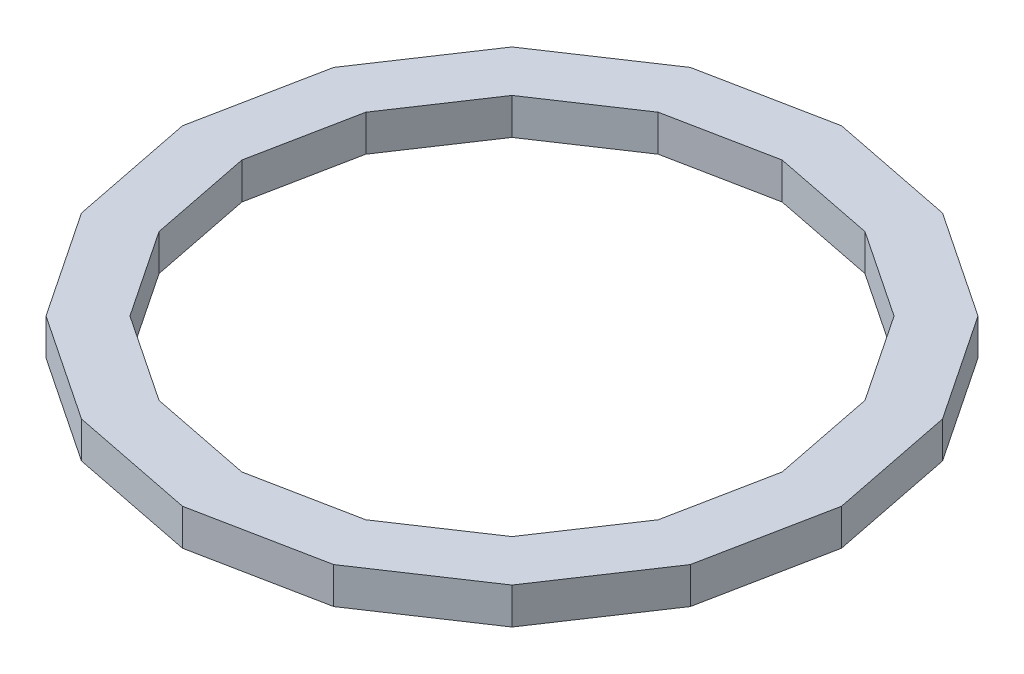
ISO-10303-21;
HEADER;
FILE_DESCRIPTION(('STEP AP214'),'2;1');
FILE_NAME('part.step','',(''),(''),'','','');
FILE_SCHEMA(('AUTOMOTIVE_DESIGN { 1 0 10303 214 1 1 1 1 }'));
ENDSEC;
DATA;
#1=APPLICATION_CONTEXT('core data for automotive mechanical design processes');
#2=APPLICATION_PROTOCOL_DEFINITION('international standard','automotive_design',2000,#1);
#3=PRODUCT_CONTEXT('',#1,'mechanical');
#4=PRODUCT('Part','Part','',(#3));
#5=PRODUCT_RELATED_PRODUCT_CATEGORY('part','',(#4));
#6=PRODUCT_DEFINITION_FORMATION('','',#4);
#7=PRODUCT_DEFINITION_CONTEXT('part definition',#1,'design');
#8=PRODUCT_DEFINITION('design','',#6,#7);
#9=PRODUCT_DEFINITION_SHAPE('','',#8);
#10=(LENGTH_UNIT() NAMED_UNIT(*) SI_UNIT(.MILLI.,.METRE.));
#11=(NAMED_UNIT(*) PLANE_ANGLE_UNIT() SI_UNIT($,.RADIAN.));
#12=(NAMED_UNIT(*) SI_UNIT($,.STERADIAN.) SOLID_ANGLE_UNIT());
#13=UNCERTAINTY_MEASURE_WITH_UNIT(LENGTH_MEASURE(1.E-05),#10,'distance_accuracy_value','');
#14=(GEOMETRIC_REPRESENTATION_CONTEXT(3) GLOBAL_UNCERTAINTY_ASSIGNED_CONTEXT((#13)) GLOBAL_UNIT_ASSIGNED_CONTEXT((#10,
#11,#12)) REPRESENTATION_CONTEXT('',''));
#15=CARTESIAN_POINT('',(0.,0.,0.));
#16=DIRECTION('',(0.,0.,1.));
#17=DIRECTION('',(1.,0.,0.));
#18=AXIS2_PLACEMENT_3D('',#15,#16,#17);
#19=CARTESIAN_POINT('',(0.,19.05,0.));
#20=DIRECTION('',(0.,1.,0.));
#21=DIRECTION('',(0.,0.,1.));
#22=AXIS2_PLACEMENT_3D('',#19,#20,#21);
#23=PLANE('',#22);
#24=DIRECTION('',(0.195090322016118,0.,-0.980785280403233));
#25=VECTOR('',#24,1.);
#26=CARTESIAN_POINT('',(159.378309212576,19.05,66.0166572239397));
#27=LINE('',#26,#25);
#28=CARTESIAN_POINT('',(159.378309212576,19.05,66.0166572239397));
#29=VERTEX_POINT('',#28);
#30=CARTESIAN_POINT('',(172.509838787481,19.05,-1.76942944563561E-12));
#31=VERTEX_POINT('',#30);
#32=EDGE_CURVE('E387',#29,#31,#27,.T.);
#33=ORIENTED_EDGE('',*,*,#32,.T.);
#34=DIRECTION('',(-0.195090322016138,0.,-0.980785280403228));
#35=VECTOR('',#34,1.);
#36=CARTESIAN_POINT('',(172.509838787481,19.05,-1.76942944563561E-12));
#37=LINE('',#36,#35);
#38=CARTESIAN_POINT('',(159.378309212574,19.05,-66.0166572239431));
#39=VERTEX_POINT('',#38);
#40=EDGE_CURVE('E391',#31,#39,#37,.T.);
#41=ORIENTED_EDGE('',*,*,#40,.T.);
#42=DIRECTION('',(-0.555570233019611,0.,-0.831469612302539));
#43=VECTOR('',#42,1.);
#44=CARTESIAN_POINT('',(159.378309212574,19.05,-66.0166572239431));
#45=LINE('',#44,#43);
#46=CARTESIAN_POINT('',(121.982876828024,19.05,-121.982876828027));
#47=VERTEX_POINT('',#46);
#48=EDGE_CURVE('E395',#39,#47,#45,.T.);
#49=ORIENTED_EDGE('',*,*,#48,.T.);
#50=DIRECTION('',(-0.831469612302551,0.,-0.555570233019593));
#51=VECTOR('',#50,1.);
#52=CARTESIAN_POINT('',(121.982876828024,19.05,-121.982876828027));
#53=LINE('',#52,#51);
#54=CARTESIAN_POINT('',(66.0166572239397,19.05,-159.378309212576));
#55=VERTEX_POINT('',#54);
#56=EDGE_CURVE('E398',#47,#55,#53,.T.);
#57=ORIENTED_EDGE('',*,*,#56,.T.);
#58=DIRECTION('',(-0.980785280403232,0.,-0.195090322016118));
#59=VECTOR('',#58,1.);
#60=CARTESIAN_POINT('',(66.0166572239397,19.05,-159.378309212576));
#61=LINE('',#60,#59);
#62=CARTESIAN_POINT('',(-1.85341869222299E-12,19.05,-172.509838787481));
#63=VERTEX_POINT('',#62);
#64=EDGE_CURVE('E401',#55,#63,#61,.T.);
#65=ORIENTED_EDGE('',*,*,#64,.T.);
#66=DIRECTION('',(-0.980785280403228,0.,0.195090322016139));
#67=VECTOR('',#66,1.);
#68=CARTESIAN_POINT('',(-1.85341869222299E-12,19.05,-172.509838787481));
#69=LINE('',#68,#67);
#70=CARTESIAN_POINT('',(-66.016657223943,19.05,-159.378309212574));
#71=VERTEX_POINT('',#70);
#72=EDGE_CURVE('E404',#63,#71,#69,.T.);
#73=ORIENTED_EDGE('',*,*,#72,.T.);
#74=DIRECTION('',(-0.83146961230254,0.,0.555570233019611));
#75=VECTOR('',#74,1.);
#76=CARTESIAN_POINT('',(-66.016657223943,19.05,-159.378309212574));
#77=LINE('',#76,#75);
#78=CARTESIAN_POINT('',(-121.982876828027,19.05,-121.982876828024));
#79=VERTEX_POINT('',#78);
#80=EDGE_CURVE('E406',#71,#79,#77,.T.);
#81=ORIENTED_EDGE('',*,*,#80,.T.);
#82=DIRECTION('',(-0.555570233019593,0.,0.831469612302551));
#83=VECTOR('',#82,1.);
#84=CARTESIAN_POINT('',(-121.982876828027,19.05,-121.982876828024));
#85=LINE('',#84,#83);
#86=CARTESIAN_POINT('',(-159.378309212576,19.05,-66.0166572239396));
#87=VERTEX_POINT('',#86);
#88=EDGE_CURVE('E408',#79,#87,#85,.T.);
#89=ORIENTED_EDGE('',*,*,#88,.T.);
#90=DIRECTION('',(-0.195090322016118,0.,0.980785280403233));
#91=VECTOR('',#90,1.);
#92=CARTESIAN_POINT('',(-159.378309212576,19.05,-66.0166572239396));
#93=LINE('',#92,#91);
#94=CARTESIAN_POINT('',(-172.509838787481,19.05,1.77661318648111E-12));
#95=VERTEX_POINT('',#94);
#96=EDGE_CURVE('E410',#87,#95,#93,.T.);
#97=ORIENTED_EDGE('',*,*,#96,.T.);
#98=DIRECTION('',(0.195090322016138,0.,0.980785280403228));
#99=VECTOR('',#98,1.);
#100=CARTESIAN_POINT('',(-172.509838787481,19.05,1.77661318648111E-12));
#101=LINE('',#100,#99);
#102=CARTESIAN_POINT('',(-159.378309212574,19.05,66.016657223943));
#103=VERTEX_POINT('',#102);
#104=EDGE_CURVE('E412',#95,#103,#101,.T.);
#105=ORIENTED_EDGE('',*,*,#104,.T.);
#106=DIRECTION('',(0.555570233019611,0.,0.83146961230254));
#107=VECTOR('',#106,1.);
#108=CARTESIAN_POINT('',(-159.378309212574,19.05,66.016657223943));
#109=LINE('',#108,#107);
#110=CARTESIAN_POINT('',(-121.982876828024,19.05,121.982876828027));
#111=VERTEX_POINT('',#110);
#112=EDGE_CURVE('E414',#103,#111,#109,.T.);
#113=ORIENTED_EDGE('',*,*,#112,.T.);
#114=DIRECTION('',(0.831469612302551,0.,0.555570233019593));
#115=VECTOR('',#114,1.);
#116=CARTESIAN_POINT('',(-121.982876828024,19.05,121.982876828027));
#117=LINE('',#116,#115);
#118=CARTESIAN_POINT('',(-66.0166572239397,19.05,159.378309212576));
#119=VERTEX_POINT('',#118);
#120=EDGE_CURVE('E416',#111,#119,#117,.T.);
#121=ORIENTED_EDGE('',*,*,#120,.T.);
#122=DIRECTION('',(0.980785280403232,0.,0.195090322016118));
#123=VECTOR('',#122,1.);
#124=CARTESIAN_POINT('',(-66.0166572239397,19.05,159.378309212576));
#125=LINE('',#124,#123);
#126=CARTESIAN_POINT('',(1.72240031464131E-12,19.05,172.509838787481));
#127=VERTEX_POINT('',#126);
#128=EDGE_CURVE('E418',#119,#127,#125,.T.);
#129=ORIENTED_EDGE('',*,*,#128,.T.);
#130=DIRECTION('',(0.980785280403228,0.,-0.195090322016138));
#131=VECTOR('',#130,1.);
#132=CARTESIAN_POINT('',(1.72240031464131E-12,19.05,172.509838787481));
#133=LINE('',#132,#131);
#134=CARTESIAN_POINT('',(66.016657223943,19.05,159.378309212574));
#135=VERTEX_POINT('',#134);
#136=EDGE_CURVE('E420',#127,#135,#133,.T.);
#137=ORIENTED_EDGE('',*,*,#136,.T.);
#138=DIRECTION('',(0.831469612302539,0.,-0.555570233019611));
#139=VECTOR('',#138,1.);
#140=CARTESIAN_POINT('',(66.016657223943,19.05,159.378309212574));
#141=LINE('',#140,#139);
#142=CARTESIAN_POINT('',(121.982876828027,19.05,121.982876828024));
#143=VERTEX_POINT('',#142);
#144=EDGE_CURVE('E422',#135,#143,#141,.T.);
#145=ORIENTED_EDGE('',*,*,#144,.T.);
#146=DIRECTION('',(0.555570233019594,0.,-0.831469612302551));
#147=VECTOR('',#146,1.);
#148=CARTESIAN_POINT('',(121.982876828027,19.05,121.982876828024));
#149=LINE('',#148,#147);
#150=EDGE_CURVE('E424',#143,#29,#149,.T.);
#151=ORIENTED_EDGE('',*,*,#150,.T.);
#152=EDGE_LOOP('',(#33,#41,#49,#57,#65,#73,#81,#89,#97,#105,#113,#121,#129,#137,#145,#151));
#153=FACE_BOUND('',#152,.T.);
#154=DIRECTION('',(-0.195090322016138,0.,-0.980785280403228));
#155=VECTOR('',#154,1.);
#156=CARTESIAN_POINT('',(141.432700285291,19.05,-1.42899333059372E-12));
#157=LINE('',#156,#155);
#158=CARTESIAN_POINT('',(141.432700285291,19.05,-1.42899333059372E-12));
#159=VERTEX_POINT('',#158);
#160=CARTESIAN_POINT('',(130.666777021383,19.05,-54.1239511938395));
#161=VERTEX_POINT('',#160);
#162=EDGE_CURVE('E251',#159,#161,#157,.T.);
#163=ORIENTED_EDGE('',*,*,#162,.F.);
#164=DIRECTION('',(0.195090322016118,0.,-0.980785280403233));
#165=VECTOR('',#164,1.);
#166=CARTESIAN_POINT('',(130.666777021384,19.05,54.1239511938368));
#167=LINE('',#166,#165);
#168=CARTESIAN_POINT('',(130.666777021384,19.05,54.1239511938368));
#169=VERTEX_POINT('',#168);
#170=EDGE_CURVE('E243',#169,#159,#167,.T.);
#171=ORIENTED_EDGE('',*,*,#170,.F.);
#172=DIRECTION('',(0.555570233019594,0.,-0.831469612302551));
#173=VECTOR('',#172,1.);
#174=CARTESIAN_POINT('',(100.008021453255,19.05,100.008021453253));
#175=LINE('',#174,#173);
#176=CARTESIAN_POINT('',(100.008021453255,19.05,100.008021453253));
#177=VERTEX_POINT('',#176);
#178=EDGE_CURVE('E303',#177,#169,#175,.T.);
#179=ORIENTED_EDGE('',*,*,#178,.F.);
#180=DIRECTION('',(0.831469612302539,0.,-0.555570233019611));
#181=VECTOR('',#180,1.);
#182=CARTESIAN_POINT('',(54.1239511938395,19.05,130.666777021383));
#183=LINE('',#182,#181);
#184=CARTESIAN_POINT('',(54.1239511938395,19.05,130.666777021383));
#185=VERTEX_POINT('',#184);
#186=EDGE_CURVE('E300',#185,#177,#183,.T.);
#187=ORIENTED_EDGE('',*,*,#186,.F.);
#188=DIRECTION('',(0.980785280403229,0.,-0.195090322016138));
#189=VECTOR('',#188,1.);
#190=CARTESIAN_POINT('',(1.45536780325047E-12,19.05,141.432700285291));
#191=LINE('',#190,#189);
#192=CARTESIAN_POINT('',(1.45536780325047E-12,19.05,141.432700285291));
#193=VERTEX_POINT('',#192);
#194=EDGE_CURVE('E298',#193,#185,#191,.T.);
#195=ORIENTED_EDGE('',*,*,#194,.F.);
#196=DIRECTION('',(0.980785280403232,0.,0.195090322016118));
#197=VECTOR('',#196,1.);
#198=CARTESIAN_POINT('',(-54.1239511938368,19.05,130.666777021384));
#199=LINE('',#198,#197);
#200=CARTESIAN_POINT('',(-54.1239511938368,19.05,130.666777021384));
#201=VERTEX_POINT('',#200);
#202=EDGE_CURVE('E296',#201,#193,#199,.T.);
#203=ORIENTED_EDGE('',*,*,#202,.F.);
#204=DIRECTION('',(0.831469612302551,0.,0.555570233019594));
#205=VECTOR('',#204,1.);
#206=CARTESIAN_POINT('',(-100.008021453253,19.05,100.008021453255));
#207=LINE('',#206,#205);
#208=CARTESIAN_POINT('',(-100.008021453253,19.05,100.008021453255));
#209=VERTEX_POINT('',#208);
#210=EDGE_CURVE('E293',#209,#201,#207,.T.);
#211=ORIENTED_EDGE('',*,*,#210,.F.);
#212=DIRECTION('',(0.555570233019611,0.,0.83146961230254));
#213=VECTOR('',#212,1.);
#214=CARTESIAN_POINT('',(-130.666777021383,19.05,54.1239511938395));
#215=LINE('',#214,#213);
#216=CARTESIAN_POINT('',(-130.666777021383,19.05,54.1239511938395));
#217=VERTEX_POINT('',#216);
#218=EDGE_CURVE('E291',#217,#209,#215,.T.);
#219=ORIENTED_EDGE('',*,*,#218,.F.);
#220=DIRECTION('',(0.195090322016139,0.,0.980785280403228));
#221=VECTOR('',#220,1.);
#222=CARTESIAN_POINT('',(-141.432700285291,19.05,1.60329975735929E-12));
#223=LINE('',#222,#221);
#224=CARTESIAN_POINT('',(-141.432700285291,19.05,1.60329975735929E-12));
#225=VERTEX_POINT('',#224);
#226=EDGE_CURVE('E289',#225,#217,#223,.T.);
#227=ORIENTED_EDGE('',*,*,#226,.F.);
#228=DIRECTION('',(-0.195090322016118,0.,0.980785280403232));
#229=VECTOR('',#228,1.);
#230=CARTESIAN_POINT('',(-130.666777021384,19.05,-54.1239511938368));
#231=LINE('',#230,#229);
#232=CARTESIAN_POINT('',(-130.666777021384,19.05,-54.1239511938368));
#233=VERTEX_POINT('',#232);
#234=EDGE_CURVE('E287',#233,#225,#231,.T.);
#235=ORIENTED_EDGE('',*,*,#234,.F.);
#236=DIRECTION('',(-0.555570233019594,0.,0.831469612302551));
#237=VECTOR('',#236,1.);
#238=CARTESIAN_POINT('',(-100.008021453255,19.05,-100.008021453253));
#239=LINE('',#238,#237);
#240=CARTESIAN_POINT('',(-100.008021453255,19.05,-100.008021453253));
#241=VERTEX_POINT('',#240);
#242=EDGE_CURVE('E285',#241,#233,#239,.T.);
#243=ORIENTED_EDGE('',*,*,#242,.F.);
#244=DIRECTION('',(-0.831469612302539,0.,0.555570233019611));
#245=VECTOR('',#244,1.);
#246=CARTESIAN_POINT('',(-54.1239511938396,19.05,-130.666777021383));
#247=LINE('',#246,#245);
#248=CARTESIAN_POINT('',(-54.1239511938396,19.05,-130.666777021383));
#249=VERTEX_POINT('',#248);
#250=EDGE_CURVE('E282',#249,#241,#247,.T.);
#251=ORIENTED_EDGE('',*,*,#250,.F.);
#252=DIRECTION('',(-0.980785280403228,0.,0.195090322016138));
#253=VECTOR('',#252,1.);
#254=CARTESIAN_POINT('',(-1.57485512909306E-12,19.05,-141.432700285291));
#255=LINE('',#254,#253);
#256=CARTESIAN_POINT('',(-1.57485512909306E-12,19.05,-141.432700285291));
#257=VERTEX_POINT('',#256);
#258=EDGE_CURVE('E280',#257,#249,#255,.T.);
#259=ORIENTED_EDGE('',*,*,#258,.F.);
#260=DIRECTION('',(-0.980785280403232,0.,-0.195090322016118));
#261=VECTOR('',#260,1.);
#262=CARTESIAN_POINT('',(54.1239511938369,19.05,-130.666777021384));
#263=LINE('',#262,#261);
#264=CARTESIAN_POINT('',(54.1239511938369,19.05,-130.666777021384));
#265=VERTEX_POINT('',#264);
#266=EDGE_CURVE('E277',#265,#257,#263,.T.);
#267=ORIENTED_EDGE('',*,*,#266,.F.);
#268=DIRECTION('',(-0.831469612302551,0.,-0.555570233019593));
#269=VECTOR('',#268,1.);
#270=CARTESIAN_POINT('',(100.008021453253,19.05,-100.008021453255));
#271=LINE('',#270,#269);
#272=CARTESIAN_POINT('',(100.008021453253,19.05,-100.008021453255));
#273=VERTEX_POINT('',#272);
#274=EDGE_CURVE('E272',#273,#265,#271,.T.);
#275=ORIENTED_EDGE('',*,*,#274,.F.);
#276=DIRECTION('',(-0.555570233019611,0.,-0.831469612302539));
#277=VECTOR('',#276,1.);
#278=CARTESIAN_POINT('',(130.666777021383,19.05,-54.1239511938395));
#279=LINE('',#278,#277);
#280=EDGE_CURVE('E265',#161,#273,#279,.T.);
#281=ORIENTED_EDGE('',*,*,#280,.F.);
#282=EDGE_LOOP('',(#163,#171,#179,#187,#195,#203,#211,#219,#227,#235,#243,#251,#259,#267,#275,#281));
#283=FACE_BOUND('',#282,.T.);
#284=ADVANCED_FACE('F34',(#153,#283),#23,.T.);
#285=CARTESIAN_POINT('',(0.,0.,0.));
#286=DIRECTION('',(0.,1.,0.));
#287=DIRECTION('',(0.,0.,1.));
#288=AXIS2_PLACEMENT_3D('',#285,#286,#287);
#289=PLANE('',#288);
#290=DIRECTION('',(0.195090322016118,0.,-0.980785280403233));
#291=VECTOR('',#290,1.);
#292=CARTESIAN_POINT('',(159.378309212576,0.,66.0166572239397));
#293=LINE('',#292,#291);
#294=CARTESIAN_POINT('',(159.378309212576,0.,66.0166572239397));
#295=VERTEX_POINT('',#294);
#296=CARTESIAN_POINT('',(172.509838787481,0.,-1.76942944563561E-12));
#297=VERTEX_POINT('',#296);
#298=EDGE_CURVE('E260',#295,#297,#293,.T.);
#299=ORIENTED_EDGE('',*,*,#298,.F.);
#300=DIRECTION('',(0.555570233019594,0.,-0.831469612302551));
#301=VECTOR('',#300,1.);
#302=CARTESIAN_POINT('',(121.982876828027,0.,121.982876828024));
#303=LINE('',#302,#301);
#304=CARTESIAN_POINT('',(121.982876828027,0.,121.982876828024));
#305=VERTEX_POINT('',#304);
#306=EDGE_CURVE('E392',#305,#295,#303,.T.);
#307=ORIENTED_EDGE('',*,*,#306,.F.);
#308=DIRECTION('',(0.831469612302539,0.,-0.555570233019611));
#309=VECTOR('',#308,1.);
#310=CARTESIAN_POINT('',(66.016657223943,0.,159.378309212574));
#311=LINE('',#310,#309);
#312=CARTESIAN_POINT('',(66.016657223943,0.,159.378309212574));
#313=VERTEX_POINT('',#312);
#314=EDGE_CURVE('E468',#313,#305,#311,.T.);
#315=ORIENTED_EDGE('',*,*,#314,.F.);
#316=DIRECTION('',(0.980785280403228,0.,-0.195090322016138));
#317=VECTOR('',#316,1.);
#318=CARTESIAN_POINT('',(1.72240031464131E-12,0.,172.509838787481));
#319=LINE('',#318,#317);
#320=CARTESIAN_POINT('',(1.72240031464131E-12,0.,172.509838787481));
#321=VERTEX_POINT('',#320);
#322=EDGE_CURVE('E465',#321,#313,#319,.T.);
#323=ORIENTED_EDGE('',*,*,#322,.F.);
#324=DIRECTION('',(0.980785280403232,0.,0.195090322016118));
#325=VECTOR('',#324,1.);
#326=CARTESIAN_POINT('',(-66.0166572239397,0.,159.378309212576));
#327=LINE('',#326,#325);
#328=CARTESIAN_POINT('',(-66.0166572239397,0.,159.378309212576));
#329=VERTEX_POINT('',#328);
#330=EDGE_CURVE('E462',#329,#321,#327,.T.);
#331=ORIENTED_EDGE('',*,*,#330,.F.);
#332=DIRECTION('',(0.831469612302551,0.,0.555570233019593));
#333=VECTOR('',#332,1.);
#334=CARTESIAN_POINT('',(-121.982876828024,0.,121.982876828027));
#335=LINE('',#334,#333);
#336=CARTESIAN_POINT('',(-121.982876828024,0.,121.982876828027));
#337=VERTEX_POINT('',#336);
#338=EDGE_CURVE('E459',#337,#329,#335,.T.);
#339=ORIENTED_EDGE('',*,*,#338,.F.);
#340=DIRECTION('',(0.555570233019611,0.,0.83146961230254));
#341=VECTOR('',#340,1.);
#342=CARTESIAN_POINT('',(-159.378309212574,0.,66.016657223943));
#343=LINE('',#342,#341);
#344=CARTESIAN_POINT('',(-159.378309212574,0.,66.016657223943));
#345=VERTEX_POINT('',#344);
#346=EDGE_CURVE('E456',#345,#337,#343,.T.);
#347=ORIENTED_EDGE('',*,*,#346,.F.);
#348=DIRECTION('',(0.195090322016138,0.,0.980785280403228));
#349=VECTOR('',#348,1.);
#350=CARTESIAN_POINT('',(-172.509838787481,0.,1.77661318648111E-12));
#351=LINE('',#350,#349);
#352=CARTESIAN_POINT('',(-172.509838787481,0.,1.77661318648111E-12));
#353=VERTEX_POINT('',#352);
#354=EDGE_CURVE('E454',#353,#345,#351,.T.);
#355=ORIENTED_EDGE('',*,*,#354,.F.);
#356=DIRECTION('',(-0.195090322016118,0.,0.980785280403233));
#357=VECTOR('',#356,1.);
#358=CARTESIAN_POINT('',(-159.378309212576,0.,-66.0166572239396));
#359=LINE('',#358,#357);
#360=CARTESIAN_POINT('',(-159.378309212576,0.,-66.0166572239396));
#361=VERTEX_POINT('',#360);
#362=EDGE_CURVE('E451',#361,#353,#359,.T.);
#363=ORIENTED_EDGE('',*,*,#362,.F.);
#364=DIRECTION('',(-0.555570233019593,0.,0.831469612302551));
#365=VECTOR('',#364,1.);
#366=CARTESIAN_POINT('',(-121.982876828027,0.,-121.982876828024));
#367=LINE('',#366,#365);
#368=CARTESIAN_POINT('',(-121.982876828027,0.,-121.982876828024));
#369=VERTEX_POINT('',#368);
#370=EDGE_CURVE('E448',#369,#361,#367,.T.);
#371=ORIENTED_EDGE('',*,*,#370,.F.);
#372=DIRECTION('',(-0.83146961230254,0.,0.555570233019611));
#373=VECTOR('',#372,1.);
#374=CARTESIAN_POINT('',(-66.016657223943,0.,-159.378309212574));
#375=LINE('',#374,#373);
#376=CARTESIAN_POINT('',(-66.016657223943,0.,-159.378309212574));
#377=VERTEX_POINT('',#376);
#378=EDGE_CURVE('E445',#377,#369,#375,.T.);
#379=ORIENTED_EDGE('',*,*,#378,.F.);
#380=DIRECTION('',(-0.980785280403228,0.,0.195090322016139));
#381=VECTOR('',#380,1.);
#382=CARTESIAN_POINT('',(-1.85341869222299E-12,0.,-172.509838787481));
#383=LINE('',#382,#381);
#384=CARTESIAN_POINT('',(-1.85341869222299E-12,0.,-172.509838787481));
#385=VERTEX_POINT('',#384);
#386=EDGE_CURVE('E443',#385,#377,#383,.T.);
#387=ORIENTED_EDGE('',*,*,#386,.F.);
#388=DIRECTION('',(-0.980785280403232,0.,-0.195090322016118));
#389=VECTOR('',#388,1.);
#390=CARTESIAN_POINT('',(66.0166572239397,0.,-159.378309212576));
#391=LINE('',#390,#389);
#392=CARTESIAN_POINT('',(66.0166572239397,0.,-159.378309212576));
#393=VERTEX_POINT('',#392);
#394=EDGE_CURVE('E440',#393,#385,#391,.T.);
#395=ORIENTED_EDGE('',*,*,#394,.F.);
#396=DIRECTION('',(-0.831469612302551,0.,-0.555570233019593));
#397=VECTOR('',#396,1.);
#398=CARTESIAN_POINT('',(121.982876828024,0.,-121.982876828027));
#399=LINE('',#398,#397);
#400=CARTESIAN_POINT('',(121.982876828024,0.,-121.982876828027));
#401=VERTEX_POINT('',#400);
#402=EDGE_CURVE('E437',#401,#393,#399,.T.);
#403=ORIENTED_EDGE('',*,*,#402,.F.);
#404=DIRECTION('',(-0.555570233019611,0.,-0.831469612302539));
#405=VECTOR('',#404,1.);
#406=CARTESIAN_POINT('',(159.378309212574,0.,-66.0166572239431));
#407=LINE('',#406,#405);
#408=CARTESIAN_POINT('',(159.378309212574,0.,-66.0166572239431));
#409=VERTEX_POINT('',#408);
#410=EDGE_CURVE('E434',#409,#401,#407,.T.);
#411=ORIENTED_EDGE('',*,*,#410,.F.);
#412=DIRECTION('',(-0.195090322016138,0.,-0.980785280403228));
#413=VECTOR('',#412,1.);
#414=CARTESIAN_POINT('',(172.509838787481,0.,-1.76942944563561E-12));
#415=LINE('',#414,#413);
#416=EDGE_CURVE('E431',#297,#409,#415,.T.);
#417=ORIENTED_EDGE('',*,*,#416,.F.);
#418=EDGE_LOOP('',(#299,#307,#315,#323,#331,#339,#347,#355,#363,#371,#379,#387,#395,#403,#411,#417));
#419=FACE_BOUND('',#418,.T.);
#420=DIRECTION('',(0.195090322016118,0.,-0.980785280403233));
#421=VECTOR('',#420,1.);
#422=CARTESIAN_POINT('',(130.666777021384,0.,54.1239511938368));
#423=LINE('',#422,#421);
#424=CARTESIAN_POINT('',(130.666777021384,0.,54.1239511938368));
#425=VERTEX_POINT('',#424);
#426=CARTESIAN_POINT('',(141.432700285291,0.,-1.42899333059372E-12));
#427=VERTEX_POINT('',#426);
#428=EDGE_CURVE('E57',#425,#427,#423,.T.);
#429=ORIENTED_EDGE('',*,*,#428,.T.);
#430=DIRECTION('',(-0.195090322016138,0.,-0.980785280403228));
#431=VECTOR('',#430,1.);
#432=CARTESIAN_POINT('',(141.432700285291,0.,-1.42899333059372E-12));
#433=LINE('',#432,#431);
#434=CARTESIAN_POINT('',(130.666777021383,0.,-54.1239511938395));
#435=VERTEX_POINT('',#434);
#436=EDGE_CURVE('E258',#427,#435,#433,.T.);
#437=ORIENTED_EDGE('',*,*,#436,.T.);
#438=DIRECTION('',(-0.555570233019611,0.,-0.831469612302539));
#439=VECTOR('',#438,1.);
#440=CARTESIAN_POINT('',(130.666777021383,0.,-54.1239511938395));
#441=LINE('',#440,#439);
#442=CARTESIAN_POINT('',(100.008021453253,0.,-100.008021453255));
#443=VERTEX_POINT('',#442);
#444=EDGE_CURVE('E310',#435,#443,#441,.T.);
#445=ORIENTED_EDGE('',*,*,#444,.T.);
#446=DIRECTION('',(-0.831469612302551,0.,-0.555570233019593));
#447=VECTOR('',#446,1.);
#448=CARTESIAN_POINT('',(100.008021453253,0.,-100.008021453255));
#449=LINE('',#448,#447);
#450=CARTESIAN_POINT('',(54.1239511938369,0.,-130.666777021384));
#451=VERTEX_POINT('',#450);
#452=EDGE_CURVE('E314',#443,#451,#449,.T.);
#453=ORIENTED_EDGE('',*,*,#452,.T.);
#454=DIRECTION('',(-0.980785280403232,0.,-0.195090322016118));
#455=VECTOR('',#454,1.);
#456=CARTESIAN_POINT('',(54.1239511938369,0.,-130.666777021384));
#457=LINE('',#456,#455);
#458=CARTESIAN_POINT('',(-1.57485512909306E-12,0.,-141.432700285291));
#459=VERTEX_POINT('',#458);
#460=EDGE_CURVE('E318',#451,#459,#457,.T.);
#461=ORIENTED_EDGE('',*,*,#460,.T.);
#462=DIRECTION('',(-0.980785280403228,0.,0.195090322016138));
#463=VECTOR('',#462,1.);
#464=CARTESIAN_POINT('',(-1.57485512909306E-12,0.,-141.432700285291));
#465=LINE('',#464,#463);
#466=CARTESIAN_POINT('',(-54.1239511938396,0.,-130.666777021383));
#467=VERTEX_POINT('',#466);
#468=EDGE_CURVE('E322',#459,#467,#465,.T.);
#469=ORIENTED_EDGE('',*,*,#468,.T.);
#470=DIRECTION('',(-0.831469612302539,0.,0.555570233019611));
#471=VECTOR('',#470,1.);
#472=CARTESIAN_POINT('',(-54.1239511938396,0.,-130.666777021383));
#473=LINE('',#472,#471);
#474=CARTESIAN_POINT('',(-100.008021453255,0.,-100.008021453253));
#475=VERTEX_POINT('',#474);
#476=EDGE_CURVE('E325',#467,#475,#473,.T.);
#477=ORIENTED_EDGE('',*,*,#476,.T.);
#478=DIRECTION('',(-0.555570233019594,0.,0.831469612302551));
#479=VECTOR('',#478,1.);
#480=CARTESIAN_POINT('',(-100.008021453255,0.,-100.008021453253));
#481=LINE('',#480,#479);
#482=CARTESIAN_POINT('',(-130.666777021384,0.,-54.1239511938368));
#483=VERTEX_POINT('',#482);
#484=EDGE_CURVE('E329',#475,#483,#481,.T.);
#485=ORIENTED_EDGE('',*,*,#484,.T.);
#486=DIRECTION('',(-0.195090322016118,0.,0.980785280403232));
#487=VECTOR('',#486,1.);
#488=CARTESIAN_POINT('',(-130.666777021384,0.,-54.1239511938368));
#489=LINE('',#488,#487);
#490=CARTESIAN_POINT('',(-141.432700285291,0.,1.60329975735929E-12));
#491=VERTEX_POINT('',#490);
#492=EDGE_CURVE('E332',#483,#491,#489,.T.);
#493=ORIENTED_EDGE('',*,*,#492,.T.);
#494=DIRECTION('',(0.195090322016139,0.,0.980785280403228));
#495=VECTOR('',#494,1.);
#496=CARTESIAN_POINT('',(-141.432700285291,0.,1.60329975735929E-12));
#497=LINE('',#496,#495);
#498=CARTESIAN_POINT('',(-130.666777021383,0.,54.1239511938395));
#499=VERTEX_POINT('',#498);
#500=EDGE_CURVE('E336',#491,#499,#497,.T.);
#501=ORIENTED_EDGE('',*,*,#500,.T.);
#502=DIRECTION('',(0.555570233019611,0.,0.83146961230254));
#503=VECTOR('',#502,1.);
#504=CARTESIAN_POINT('',(-130.666777021383,0.,54.1239511938395));
#505=LINE('',#504,#503);
#506=CARTESIAN_POINT('',(-100.008021453253,0.,100.008021453255));
#507=VERTEX_POINT('',#506);
#508=EDGE_CURVE('E339',#499,#507,#505,.T.);
#509=ORIENTED_EDGE('',*,*,#508,.T.);
#510=DIRECTION('',(0.831469612302551,0.,0.555570233019594));
#511=VECTOR('',#510,1.);
#512=CARTESIAN_POINT('',(-100.008021453253,0.,100.008021453255));
#513=LINE('',#512,#511);
#514=CARTESIAN_POINT('',(-54.1239511938368,0.,130.666777021384));
#515=VERTEX_POINT('',#514);
#516=EDGE_CURVE('E343',#507,#515,#513,.T.);
#517=ORIENTED_EDGE('',*,*,#516,.T.);
#518=DIRECTION('',(0.980785280403232,0.,0.195090322016118));
#519=VECTOR('',#518,1.);
#520=CARTESIAN_POINT('',(-54.1239511938368,0.,130.666777021384));
#521=LINE('',#520,#519);
#522=CARTESIAN_POINT('',(1.45536780325047E-12,0.,141.432700285291));
#523=VERTEX_POINT('',#522);
#524=EDGE_CURVE('E346',#515,#523,#521,.T.);
#525=ORIENTED_EDGE('',*,*,#524,.T.);
#526=DIRECTION('',(0.980785280403229,0.,-0.195090322016138));
#527=VECTOR('',#526,1.);
#528=CARTESIAN_POINT('',(1.45536780325047E-12,0.,141.432700285291));
#529=LINE('',#528,#527);
#530=CARTESIAN_POINT('',(54.1239511938395,0.,130.666777021383));
#531=VERTEX_POINT('',#530);
#532=EDGE_CURVE('E349',#523,#531,#529,.T.);
#533=ORIENTED_EDGE('',*,*,#532,.T.);
#534=DIRECTION('',(0.831469612302539,0.,-0.555570233019611));
#535=VECTOR('',#534,1.);
#536=CARTESIAN_POINT('',(54.1239511938395,0.,130.666777021383));
#537=LINE('',#536,#535);
#538=CARTESIAN_POINT('',(100.008021453255,0.,100.008021453253));
#539=VERTEX_POINT('',#538);
#540=EDGE_CURVE('E352',#531,#539,#537,.T.);
#541=ORIENTED_EDGE('',*,*,#540,.T.);
#542=DIRECTION('',(0.555570233019594,0.,-0.831469612302551));
#543=VECTOR('',#542,1.);
#544=CARTESIAN_POINT('',(100.008021453255,0.,100.008021453253));
#545=LINE('',#544,#543);
#546=EDGE_CURVE('E252',#539,#425,#545,.T.);
#547=ORIENTED_EDGE('',*,*,#546,.T.);
#548=EDGE_LOOP('',(#429,#437,#445,#453,#461,#469,#477,#485,#493,#501,#509,#517,#525,#533,#541,#547));
#549=FACE_BOUND('',#548,.T.);
#550=ADVANCED_FACE('F530',(#419,#549),#289,.F.);
#551=CARTESIAN_POINT('',(159.378309212576,19.05,66.0166572239397));
#552=DIRECTION('',(-0.980785280403233,0.,-0.195090322016118));
#553=DIRECTION('',(-0.195090322016118,0.,0.980785280403233));
#554=AXIS2_PLACEMENT_3D('',#551,#552,#553);
#555=PLANE('',#554);
#556=ORIENTED_EDGE('',*,*,#298,.T.);
#557=DIRECTION('',(0.,-1.,0.));
#558=VECTOR('',#557,1.);
#559=CARTESIAN_POINT('',(172.509838787481,19.05,-1.76942944563561E-12));
#560=LINE('',#559,#558);
#561=EDGE_CURVE('E11',#31,#297,#560,.T.);
#562=ORIENTED_EDGE('',*,*,#561,.F.);
#563=ORIENTED_EDGE('',*,*,#32,.F.);
#564=DIRECTION('',(0.,-1.,0.));
#565=VECTOR('',#564,1.);
#566=CARTESIAN_POINT('',(159.378309212576,19.05,66.0166572239397));
#567=LINE('',#566,#565);
#568=EDGE_CURVE('E427',#29,#295,#567,.T.);
#569=ORIENTED_EDGE('',*,*,#568,.T.);
#570=EDGE_LOOP('',(#556,#562,#563,#569));
#571=FACE_BOUND('',#570,.T.);
#572=ADVANCED_FACE('F36',(#571),#555,.F.);
#573=CARTESIAN_POINT('',(172.509838787481,19.05,-1.76942944563561E-12));
#574=DIRECTION('',(-0.980785280403228,0.,0.195090322016138));
#575=DIRECTION('',(0.195090322016138,0.,0.980785280403229));
#576=AXIS2_PLACEMENT_3D('',#573,#574,#575);
#577=PLANE('',#576);
#578=ORIENTED_EDGE('',*,*,#416,.T.);
#579=DIRECTION('',(0.,-1.,0.));
#580=VECTOR('',#579,1.);
#581=CARTESIAN_POINT('',(159.378309212574,19.05,-66.0166572239431));
#582=LINE('',#581,#580);
#583=EDGE_CURVE('E42',#39,#409,#582,.T.);
#584=ORIENTED_EDGE('',*,*,#583,.F.);
#585=ORIENTED_EDGE('',*,*,#40,.F.);
#586=ORIENTED_EDGE('',*,*,#561,.T.);
#587=EDGE_LOOP('',(#578,#584,#585,#586));
#588=FACE_BOUND('',#587,.T.);
#589=ADVANCED_FACE('F547',(#588),#577,.F.);
#590=CARTESIAN_POINT('',(159.378309212574,19.05,-66.0166572239431));
#591=DIRECTION('',(-0.831469612302539,0.,0.555570233019611));
#592=DIRECTION('',(0.555570233019611,0.,0.831469612302539));
#593=AXIS2_PLACEMENT_3D('',#590,#591,#592);
#594=PLANE('',#593);
#595=ORIENTED_EDGE('',*,*,#410,.T.);
#596=DIRECTION('',(0.,-1.,0.));
#597=VECTOR('',#596,1.);
#598=CARTESIAN_POINT('',(121.982876828024,19.05,-121.982876828027));
#599=LINE('',#598,#597);
#600=EDGE_CURVE('E513',#47,#401,#599,.T.);
#601=ORIENTED_EDGE('',*,*,#600,.F.);
#602=ORIENTED_EDGE('',*,*,#48,.F.);
#603=ORIENTED_EDGE('',*,*,#583,.T.);
#604=EDGE_LOOP('',(#595,#601,#602,#603));
#605=FACE_BOUND('',#604,.T.);
#606=ADVANCED_FACE('F524',(#605),#594,.F.);
#607=CARTESIAN_POINT('',(121.982876828024,19.05,-121.982876828027));
#608=DIRECTION('',(-0.555570233019593,0.,0.831469612302551));
#609=DIRECTION('',(0.831469612302551,0.,0.555570233019593));
#610=AXIS2_PLACEMENT_3D('',#607,#608,#609);
#611=PLANE('',#610);
#612=ORIENTED_EDGE('',*,*,#402,.T.);
#613=DIRECTION('',(0.,-1.,0.));
#614=VECTOR('',#613,1.);
#615=CARTESIAN_POINT('',(66.0166572239397,19.05,-159.378309212576));
#616=LINE('',#615,#614);
#617=EDGE_CURVE('E509',#55,#393,#616,.T.);
#618=ORIENTED_EDGE('',*,*,#617,.F.);
#619=ORIENTED_EDGE('',*,*,#56,.F.);
#620=ORIENTED_EDGE('',*,*,#600,.T.);
#621=EDGE_LOOP('',(#612,#618,#619,#620));
#622=FACE_BOUND('',#621,.T.);
#623=ADVANCED_FACE('F536',(#622),#611,.F.);
#624=CARTESIAN_POINT('',(66.0166572239397,19.05,-159.378309212576));
#625=DIRECTION('',(-0.195090322016118,0.,0.980785280403232));
#626=DIRECTION('',(0.980785280403233,0.,0.195090322016118));
#627=AXIS2_PLACEMENT_3D('',#624,#625,#626);
#628=PLANE('',#627);
#629=ORIENTED_EDGE('',*,*,#394,.T.);
#630=DIRECTION('',(0.,-1.,0.));
#631=VECTOR('',#630,1.);
#632=CARTESIAN_POINT('',(-1.85341869222299E-12,19.05,-172.509838787481));
#633=LINE('',#632,#631);
#634=EDGE_CURVE('E506',#63,#385,#633,.T.);
#635=ORIENTED_EDGE('',*,*,#634,.F.);
#636=ORIENTED_EDGE('',*,*,#64,.F.);
#637=ORIENTED_EDGE('',*,*,#617,.T.);
#638=EDGE_LOOP('',(#629,#635,#636,#637));
#639=FACE_BOUND('',#638,.T.);
#640=ADVANCED_FACE('F540',(#639),#628,.F.);
#641=CARTESIAN_POINT('',(-1.85341869222299E-12,19.05,-172.509838787481));
#642=DIRECTION('',(0.195090322016139,0.,0.980785280403228));
#643=DIRECTION('',(0.980785280403229,0.,-0.195090322016139));
#644=AXIS2_PLACEMENT_3D('',#641,#642,#643);
#645=PLANE('',#644);
#646=ORIENTED_EDGE('',*,*,#386,.T.);
#647=DIRECTION('',(0.,-1.,0.));
#648=VECTOR('',#647,1.);
#649=CARTESIAN_POINT('',(-66.016657223943,19.05,-159.378309212574));
#650=LINE('',#649,#648);
#651=EDGE_CURVE('E503',#71,#377,#650,.T.);
#652=ORIENTED_EDGE('',*,*,#651,.F.);
#653=ORIENTED_EDGE('',*,*,#72,.F.);
#654=ORIENTED_EDGE('',*,*,#634,.T.);
#655=EDGE_LOOP('',(#646,#652,#653,#654));
#656=FACE_BOUND('',#655,.T.);
#657=ADVANCED_FACE('F600',(#656),#645,.F.);
#658=CARTESIAN_POINT('',(-66.016657223943,19.05,-159.378309212574));
#659=DIRECTION('',(0.555570233019611,0.,0.83146961230254));
#660=DIRECTION('',(0.83146961230254,0.,-0.555570233019611));
#661=AXIS2_PLACEMENT_3D('',#658,#659,#660);
#662=PLANE('',#661);
#663=ORIENTED_EDGE('',*,*,#378,.T.);
#664=DIRECTION('',(0.,-1.,0.));
#665=VECTOR('',#664,1.);
#666=CARTESIAN_POINT('',(-121.982876828027,19.05,-121.982876828024));
#667=LINE('',#666,#665);
#668=EDGE_CURVE('E500',#79,#369,#667,.T.);
#669=ORIENTED_EDGE('',*,*,#668,.F.);
#670=ORIENTED_EDGE('',*,*,#80,.F.);
#671=ORIENTED_EDGE('',*,*,#651,.T.);
#672=EDGE_LOOP('',(#663,#669,#670,#671));
#673=FACE_BOUND('',#672,.T.);
#674=ADVANCED_FACE('F597',(#673),#662,.F.);
#675=CARTESIAN_POINT('',(-121.982876828027,19.05,-121.982876828024));
#676=DIRECTION('',(0.831469612302551,0.,0.555570233019593));
#677=DIRECTION('',(0.555570233019593,0.,-0.831469612302551));
#678=AXIS2_PLACEMENT_3D('',#675,#676,#677);
#679=PLANE('',#678);
#680=ORIENTED_EDGE('',*,*,#370,.T.);
#681=DIRECTION('',(0.,-1.,0.));
#682=VECTOR('',#681,1.);
#683=CARTESIAN_POINT('',(-159.378309212576,19.05,-66.0166572239396));
#684=LINE('',#683,#682);
#685=EDGE_CURVE('E497',#87,#361,#684,.T.);
#686=ORIENTED_EDGE('',*,*,#685,.F.);
#687=ORIENTED_EDGE('',*,*,#88,.F.);
#688=ORIENTED_EDGE('',*,*,#668,.T.);
#689=EDGE_LOOP('',(#680,#686,#687,#688));
#690=FACE_BOUND('',#689,.T.);
#691=ADVANCED_FACE('F593',(#690),#679,.F.);
#692=CARTESIAN_POINT('',(-159.378309212576,19.05,-66.0166572239396));
#693=DIRECTION('',(0.980785280403232,0.,0.195090322016118));
#694=DIRECTION('',(0.195090322016118,0.,-0.980785280403233));
#695=AXIS2_PLACEMENT_3D('',#692,#693,#694);
#696=PLANE('',#695);
#697=ORIENTED_EDGE('',*,*,#362,.T.);
#698=DIRECTION('',(0.,-1.,0.));
#699=VECTOR('',#698,1.);
#700=CARTESIAN_POINT('',(-172.509838787481,19.05,1.77661318648111E-12));
#701=LINE('',#700,#699);
#702=EDGE_CURVE('E494',#95,#353,#701,.T.);
#703=ORIENTED_EDGE('',*,*,#702,.F.);
#704=ORIENTED_EDGE('',*,*,#96,.F.);
#705=ORIENTED_EDGE('',*,*,#685,.T.);
#706=EDGE_LOOP('',(#697,#703,#704,#705));
#707=FACE_BOUND('',#706,.T.);
#708=ADVANCED_FACE('F589',(#707),#696,.F.);
#709=CARTESIAN_POINT('',(-172.509838787481,19.05,1.77661318648111E-12));
#710=DIRECTION('',(0.980785280403228,0.,-0.195090322016138));
#711=DIRECTION('',(-0.195090322016139,0.,-0.980785280403229));
#712=AXIS2_PLACEMENT_3D('',#709,#710,#711);
#713=PLANE('',#712);
#714=ORIENTED_EDGE('',*,*,#354,.T.);
#715=DIRECTION('',(0.,-1.,0.));
#716=VECTOR('',#715,1.);
#717=CARTESIAN_POINT('',(-159.378309212574,19.05,66.016657223943));
#718=LINE('',#717,#716);
#719=EDGE_CURVE('E491',#103,#345,#718,.T.);
#720=ORIENTED_EDGE('',*,*,#719,.F.);
#721=ORIENTED_EDGE('',*,*,#104,.F.);
#722=ORIENTED_EDGE('',*,*,#702,.T.);
#723=EDGE_LOOP('',(#714,#720,#721,#722));
#724=FACE_BOUND('',#723,.T.);
#725=ADVANCED_FACE('F584',(#724),#713,.F.);
#726=CARTESIAN_POINT('',(-159.378309212574,19.05,66.016657223943));
#727=DIRECTION('',(0.831469612302539,0.,-0.555570233019611));
#728=DIRECTION('',(-0.555570233019611,0.,-0.83146961230254));
#729=AXIS2_PLACEMENT_3D('',#726,#727,#728);
#730=PLANE('',#729);
#731=ORIENTED_EDGE('',*,*,#346,.T.);
#732=DIRECTION('',(0.,-1.,0.));
#733=VECTOR('',#732,1.);
#734=CARTESIAN_POINT('',(-121.982876828024,19.05,121.982876828027));
#735=LINE('',#734,#733);
#736=EDGE_CURVE('E487',#111,#337,#735,.T.);
#737=ORIENTED_EDGE('',*,*,#736,.F.);
#738=ORIENTED_EDGE('',*,*,#112,.F.);
#739=ORIENTED_EDGE('',*,*,#719,.T.);
#740=EDGE_LOOP('',(#731,#737,#738,#739));
#741=FACE_BOUND('',#740,.T.);
#742=ADVANCED_FACE('F578',(#741),#730,.F.);
#743=CARTESIAN_POINT('',(-121.982876828024,19.05,121.982876828027));
#744=DIRECTION('',(0.555570233019593,0.,-0.831469612302551));
#745=DIRECTION('',(-0.831469612302551,0.,-0.555570233019593));
#746=AXIS2_PLACEMENT_3D('',#743,#744,#745);
#747=PLANE('',#746);
#748=ORIENTED_EDGE('',*,*,#338,.T.);
#749=DIRECTION('',(0.,-1.,0.));
#750=VECTOR('',#749,1.);
#751=CARTESIAN_POINT('',(-66.0166572239397,19.05,159.378309212576));
#752=LINE('',#751,#750);
#753=EDGE_CURVE('E483',#119,#329,#752,.T.);
#754=ORIENTED_EDGE('',*,*,#753,.F.);
#755=ORIENTED_EDGE('',*,*,#120,.F.);
#756=ORIENTED_EDGE('',*,*,#736,.T.);
#757=EDGE_LOOP('',(#748,#754,#755,#756));
#758=FACE_BOUND('',#757,.T.);
#759=ADVANCED_FACE('F574',(#758),#747,.F.);
#760=CARTESIAN_POINT('',(-66.0166572239397,19.05,159.378309212576));
#761=DIRECTION('',(0.195090322016118,0.,-0.980785280403232));
#762=DIRECTION('',(-0.980785280403232,0.,-0.195090322016118));
#763=AXIS2_PLACEMENT_3D('',#760,#761,#762);
#764=PLANE('',#763);
#765=ORIENTED_EDGE('',*,*,#330,.T.);
#766=DIRECTION('',(0.,-1.,0.));
#767=VECTOR('',#766,1.);
#768=CARTESIAN_POINT('',(1.72240031464131E-12,19.05,172.509838787481));
#769=LINE('',#768,#767);
#770=EDGE_CURVE('E480',#127,#321,#769,.T.);
#771=ORIENTED_EDGE('',*,*,#770,.F.);
#772=ORIENTED_EDGE('',*,*,#128,.F.);
#773=ORIENTED_EDGE('',*,*,#753,.T.);
#774=EDGE_LOOP('',(#765,#771,#772,#773));
#775=FACE_BOUND('',#774,.T.);
#776=ADVANCED_FACE('F569',(#775),#764,.F.);
#777=CARTESIAN_POINT('',(1.72240031464131E-12,19.05,172.509838787481));
#778=DIRECTION('',(-0.195090322016138,0.,-0.980785280403229));
#779=DIRECTION('',(-0.980785280403229,0.,0.195090322016138));
#780=AXIS2_PLACEMENT_3D('',#777,#778,#779);
#781=PLANE('',#780);
#782=ORIENTED_EDGE('',*,*,#322,.T.);
#783=DIRECTION('',(0.,-1.,0.));
#784=VECTOR('',#783,1.);
#785=CARTESIAN_POINT('',(66.016657223943,19.05,159.378309212574));
#786=LINE('',#785,#784);
#787=EDGE_CURVE('E477',#135,#313,#786,.T.);
#788=ORIENTED_EDGE('',*,*,#787,.F.);
#789=ORIENTED_EDGE('',*,*,#136,.F.);
#790=ORIENTED_EDGE('',*,*,#770,.T.);
#791=EDGE_LOOP('',(#782,#788,#789,#790));
#792=FACE_BOUND('',#791,.T.);
#793=ADVANCED_FACE('F563',(#792),#781,.F.);
#794=CARTESIAN_POINT('',(66.016657223943,19.05,159.378309212574));
#795=DIRECTION('',(-0.555570233019611,0.,-0.831469612302539));
#796=DIRECTION('',(-0.831469612302539,0.,0.555570233019611));
#797=AXIS2_PLACEMENT_3D('',#794,#795,#796);
#798=PLANE('',#797);
#799=ORIENTED_EDGE('',*,*,#314,.T.);
#800=DIRECTION('',(0.,-1.,0.));
#801=VECTOR('',#800,1.);
#802=CARTESIAN_POINT('',(121.982876828027,19.05,121.982876828024));
#803=LINE('',#802,#801);
#804=EDGE_CURVE('E474',#143,#305,#803,.T.);
#805=ORIENTED_EDGE('',*,*,#804,.F.);
#806=ORIENTED_EDGE('',*,*,#144,.F.);
#807=ORIENTED_EDGE('',*,*,#787,.T.);
#808=EDGE_LOOP('',(#799,#805,#806,#807));
#809=FACE_BOUND('',#808,.T.);
#810=ADVANCED_FACE('F559',(#809),#798,.F.);
#811=CARTESIAN_POINT('',(121.982876828027,19.05,121.982876828024));
#812=DIRECTION('',(-0.831469612302551,0.,-0.555570233019594));
#813=DIRECTION('',(-0.555570233019594,0.,0.831469612302551));
#814=AXIS2_PLACEMENT_3D('',#811,#812,#813);
#815=PLANE('',#814);
#816=ORIENTED_EDGE('',*,*,#306,.T.);
#817=ORIENTED_EDGE('',*,*,#568,.F.);
#818=ORIENTED_EDGE('',*,*,#150,.F.);
#819=ORIENTED_EDGE('',*,*,#804,.T.);
#820=EDGE_LOOP('',(#816,#817,#818,#819));
#821=FACE_BOUND('',#820,.T.);
#822=ADVANCED_FACE('F554',(#821),#815,.F.);
#823=CARTESIAN_POINT('',(130.666777021384,19.05,54.1239511938368));
#824=DIRECTION('',(-0.980785280403233,0.,-0.195090322016118));
#825=DIRECTION('',(-0.195090322016118,0.,0.980785280403233));
#826=AXIS2_PLACEMENT_3D('',#823,#824,#825);
#827=PLANE('',#826);
#828=ORIENTED_EDGE('',*,*,#428,.F.);
#829=DIRECTION('',(0.,-1.,0.));
#830=VECTOR('',#829,1.);
#831=CARTESIAN_POINT('',(130.666777021384,19.05,54.1239511938368));
#832=LINE('',#831,#830);
#833=EDGE_CURVE('E247',#169,#425,#832,.T.);
#834=ORIENTED_EDGE('',*,*,#833,.F.);
#835=ORIENTED_EDGE('',*,*,#170,.T.);
#836=DIRECTION('',(0.,-1.,0.));
#837=VECTOR('',#836,1.);
#838=CARTESIAN_POINT('',(141.432700285291,19.05,-1.42899333059372E-12));
#839=LINE('',#838,#837);
#840=EDGE_CURVE('E246',#159,#427,#839,.T.);
#841=ORIENTED_EDGE('',*,*,#840,.T.);
#842=EDGE_LOOP('',(#828,#834,#835,#841));
#843=FACE_BOUND('',#842,.T.);
#844=ADVANCED_FACE('F245',(#843),#827,.T.);
#845=CARTESIAN_POINT('',(141.432700285291,19.05,-1.42899333059372E-12));
#846=DIRECTION('',(-0.980785280403229,0.,0.195090322016138));
#847=DIRECTION('',(0.195090322016138,0.,0.980785280403229));
#848=AXIS2_PLACEMENT_3D('',#845,#846,#847);
#849=PLANE('',#848);
#850=ORIENTED_EDGE('',*,*,#436,.F.);
#851=ORIENTED_EDGE('',*,*,#840,.F.);
#852=ORIENTED_EDGE('',*,*,#162,.T.);
#853=DIRECTION('',(0.,-1.,0.));
#854=VECTOR('',#853,1.);
#855=CARTESIAN_POINT('',(130.666777021383,19.05,-54.1239511938395));
#856=LINE('',#855,#854);
#857=EDGE_CURVE('E261',#161,#435,#856,.T.);
#858=ORIENTED_EDGE('',*,*,#857,.T.);
#859=EDGE_LOOP('',(#850,#851,#852,#858));
#860=FACE_BOUND('',#859,.T.);
#861=ADVANCED_FACE('F255',(#860),#849,.T.);
#862=CARTESIAN_POINT('',(130.666777021383,19.05,-54.1239511938395));
#863=DIRECTION('',(-0.831469612302539,0.,0.555570233019611));
#864=DIRECTION('',(0.555570233019611,0.,0.831469612302539));
#865=AXIS2_PLACEMENT_3D('',#862,#863,#864);
#866=PLANE('',#865);
#867=ORIENTED_EDGE('',*,*,#444,.F.);
#868=ORIENTED_EDGE('',*,*,#857,.F.);
#869=ORIENTED_EDGE('',*,*,#280,.T.);
#870=DIRECTION('',(0.,-1.,0.));
#871=VECTOR('',#870,1.);
#872=CARTESIAN_POINT('',(100.008021453253,19.05,-100.008021453255));
#873=LINE('',#872,#871);
#874=EDGE_CURVE('E383',#273,#443,#873,.T.);
#875=ORIENTED_EDGE('',*,*,#874,.T.);
#876=EDGE_LOOP('',(#867,#868,#869,#875));
#877=FACE_BOUND('',#876,.T.);
#878=ADVANCED_FACE('F682',(#877),#866,.T.);
#879=CARTESIAN_POINT('',(100.008021453253,19.05,-100.008021453255));
#880=DIRECTION('',(-0.555570233019594,0.,0.831469612302551));
#881=DIRECTION('',(0.831469612302551,0.,0.555570233019594));
#882=AXIS2_PLACEMENT_3D('',#879,#880,#881);
#883=PLANE('',#882);
#884=ORIENTED_EDGE('',*,*,#452,.F.);
#885=ORIENTED_EDGE('',*,*,#874,.F.);
#886=ORIENTED_EDGE('',*,*,#274,.T.);
#887=DIRECTION('',(0.,-1.,0.));
#888=VECTOR('',#887,1.);
#889=CARTESIAN_POINT('',(54.1239511938369,19.05,-130.666777021384));
#890=LINE('',#889,#888);
#891=EDGE_CURVE('E381',#265,#451,#890,.T.);
#892=ORIENTED_EDGE('',*,*,#891,.T.);
#893=EDGE_LOOP('',(#884,#885,#886,#892));
#894=FACE_BOUND('',#893,.T.);
#895=ADVANCED_FACE('F688',(#894),#883,.T.);
#896=CARTESIAN_POINT('',(54.1239511938369,19.05,-130.666777021384));
#897=DIRECTION('',(-0.195090322016118,0.,0.980785280403233));
#898=DIRECTION('',(0.980785280403233,0.,0.195090322016118));
#899=AXIS2_PLACEMENT_3D('',#896,#897,#898);
#900=PLANE('',#899);
#901=ORIENTED_EDGE('',*,*,#460,.F.);
#902=ORIENTED_EDGE('',*,*,#891,.F.);
#903=ORIENTED_EDGE('',*,*,#266,.T.);
#904=DIRECTION('',(0.,-1.,0.));
#905=VECTOR('',#904,1.);
#906=CARTESIAN_POINT('',(-1.57485512909306E-12,19.05,-141.432700285291));
#907=LINE('',#906,#905);
#908=EDGE_CURVE('E379',#257,#459,#907,.T.);
#909=ORIENTED_EDGE('',*,*,#908,.T.);
#910=EDGE_LOOP('',(#901,#902,#903,#909));
#911=FACE_BOUND('',#910,.T.);
#912=ADVANCED_FACE('F696',(#911),#900,.T.);
#913=CARTESIAN_POINT('',(-1.57485512909306E-12,19.05,-141.432700285291));
#914=DIRECTION('',(0.195090322016138,0.,0.980785280403228));
#915=DIRECTION('',(0.980785280403229,0.,-0.195090322016138));
#916=AXIS2_PLACEMENT_3D('',#913,#914,#915);
#917=PLANE('',#916);
#918=ORIENTED_EDGE('',*,*,#468,.F.);
#919=ORIENTED_EDGE('',*,*,#908,.F.);
#920=ORIENTED_EDGE('',*,*,#258,.T.);
#921=DIRECTION('',(0.,-1.,0.));
#922=VECTOR('',#921,1.);
#923=CARTESIAN_POINT('',(-54.1239511938396,19.05,-130.666777021383));
#924=LINE('',#923,#922);
#925=EDGE_CURVE('E377',#249,#467,#924,.T.);
#926=ORIENTED_EDGE('',*,*,#925,.T.);
#927=EDGE_LOOP('',(#918,#919,#920,#926));
#928=FACE_BOUND('',#927,.T.);
#929=ADVANCED_FACE('F705',(#928),#917,.T.);
#930=CARTESIAN_POINT('',(-54.1239511938396,19.05,-130.666777021383));
#931=DIRECTION('',(0.555570233019611,0.,0.831469612302539));
#932=DIRECTION('',(0.831469612302539,0.,-0.555570233019611));
#933=AXIS2_PLACEMENT_3D('',#930,#931,#932);
#934=PLANE('',#933);
#935=ORIENTED_EDGE('',*,*,#476,.F.);
#936=ORIENTED_EDGE('',*,*,#925,.F.);
#937=ORIENTED_EDGE('',*,*,#250,.T.);
#938=DIRECTION('',(0.,-1.,0.));
#939=VECTOR('',#938,1.);
#940=CARTESIAN_POINT('',(-100.008021453255,19.05,-100.008021453253));
#941=LINE('',#940,#939);
#942=EDGE_CURVE('E375',#241,#475,#941,.T.);
#943=ORIENTED_EDGE('',*,*,#942,.T.);
#944=EDGE_LOOP('',(#935,#936,#937,#943));
#945=FACE_BOUND('',#944,.T.);
#946=ADVANCED_FACE('F712',(#945),#934,.T.);
#947=CARTESIAN_POINT('',(-100.008021453255,19.05,-100.008021453253));
#948=DIRECTION('',(0.831469612302551,0.,0.555570233019593));
#949=DIRECTION('',(0.555570233019594,0.,-0.831469612302551));
#950=AXIS2_PLACEMENT_3D('',#947,#948,#949);
#951=PLANE('',#950);
#952=ORIENTED_EDGE('',*,*,#484,.F.);
#953=ORIENTED_EDGE('',*,*,#942,.F.);
#954=ORIENTED_EDGE('',*,*,#242,.T.);
#955=DIRECTION('',(0.,-1.,0.));
#956=VECTOR('',#955,1.);
#957=CARTESIAN_POINT('',(-130.666777021384,19.05,-54.1239511938368));
#958=LINE('',#957,#956);
#959=EDGE_CURVE('E373',#233,#483,#958,.T.);
#960=ORIENTED_EDGE('',*,*,#959,.T.);
#961=EDGE_LOOP('',(#952,#953,#954,#960));
#962=FACE_BOUND('',#961,.T.);
#963=ADVANCED_FACE('F720',(#962),#951,.T.);
#964=CARTESIAN_POINT('',(-130.666777021384,19.05,-54.1239511938368));
#965=DIRECTION('',(0.980785280403232,0.,0.195090322016118));
#966=DIRECTION('',(0.195090322016118,0.,-0.980785280403233));
#967=AXIS2_PLACEMENT_3D('',#964,#965,#966);
#968=PLANE('',#967);
#969=ORIENTED_EDGE('',*,*,#492,.F.);
#970=ORIENTED_EDGE('',*,*,#959,.F.);
#971=ORIENTED_EDGE('',*,*,#234,.T.);
#972=DIRECTION('',(0.,-1.,0.));
#973=VECTOR('',#972,1.);
#974=CARTESIAN_POINT('',(-141.432700285291,19.05,1.60329975735929E-12));
#975=LINE('',#974,#973);
#976=EDGE_CURVE('E371',#225,#491,#975,.T.);
#977=ORIENTED_EDGE('',*,*,#976,.T.);
#978=EDGE_LOOP('',(#969,#970,#971,#977));
#979=FACE_BOUND('',#978,.T.);
#980=ADVANCED_FACE('F728',(#979),#968,.T.);
#981=CARTESIAN_POINT('',(-141.432700285291,19.05,1.60329975735929E-12));
#982=DIRECTION('',(0.980785280403228,0.,-0.195090322016139));
#983=DIRECTION('',(-0.195090322016139,0.,-0.980785280403229));
#984=AXIS2_PLACEMENT_3D('',#981,#982,#983);
#985=PLANE('',#984);
#986=ORIENTED_EDGE('',*,*,#500,.F.);
#987=ORIENTED_EDGE('',*,*,#976,.F.);
#988=ORIENTED_EDGE('',*,*,#226,.T.);
#989=DIRECTION('',(0.,-1.,0.));
#990=VECTOR('',#989,1.);
#991=CARTESIAN_POINT('',(-130.666777021383,19.05,54.1239511938395));
#992=LINE('',#991,#990);
#993=EDGE_CURVE('E369',#217,#499,#992,.T.);
#994=ORIENTED_EDGE('',*,*,#993,.T.);
#995=EDGE_LOOP('',(#986,#987,#988,#994));
#996=FACE_BOUND('',#995,.T.);
#997=ADVANCED_FACE('F735',(#996),#985,.T.);
#998=CARTESIAN_POINT('',(-130.666777021383,19.05,54.1239511938395));
#999=DIRECTION('',(0.83146961230254,0.,-0.555570233019611));
#1000=DIRECTION('',(-0.555570233019611,0.,-0.83146961230254));
#1001=AXIS2_PLACEMENT_3D('',#998,#999,#1000);
#1002=PLANE('',#1001);
#1003=ORIENTED_EDGE('',*,*,#508,.F.);
#1004=ORIENTED_EDGE('',*,*,#993,.F.);
#1005=ORIENTED_EDGE('',*,*,#218,.T.);
#1006=DIRECTION('',(0.,-1.,0.));
#1007=VECTOR('',#1006,1.);
#1008=CARTESIAN_POINT('',(-100.008021453253,19.05,100.008021453255));
#1009=LINE('',#1008,#1007);
#1010=EDGE_CURVE('E367',#209,#507,#1009,.T.);
#1011=ORIENTED_EDGE('',*,*,#1010,.T.);
#1012=EDGE_LOOP('',(#1003,#1004,#1005,#1011));
#1013=FACE_BOUND('',#1012,.T.);
#1014=ADVANCED_FACE('F743',(#1013),#1002,.T.);
#1015=CARTESIAN_POINT('',(-100.008021453253,19.05,100.008021453255));
#1016=DIRECTION('',(0.555570233019594,0.,-0.831469612302551));
#1017=DIRECTION('',(-0.831469612302551,0.,-0.555570233019594));
#1018=AXIS2_PLACEMENT_3D('',#1015,#1016,#1017);
#1019=PLANE('',#1018);
#1020=ORIENTED_EDGE('',*,*,#516,.F.);
#1021=ORIENTED_EDGE('',*,*,#1010,.F.);
#1022=ORIENTED_EDGE('',*,*,#210,.T.);
#1023=DIRECTION('',(0.,-1.,0.));
#1024=VECTOR('',#1023,1.);
#1025=CARTESIAN_POINT('',(-54.1239511938368,19.05,130.666777021384));
#1026=LINE('',#1025,#1024);
#1027=EDGE_CURVE('E365',#201,#515,#1026,.T.);
#1028=ORIENTED_EDGE('',*,*,#1027,.T.);
#1029=EDGE_LOOP('',(#1020,#1021,#1022,#1028));
#1030=FACE_BOUND('',#1029,.T.);
#1031=ADVANCED_FACE('F751',(#1030),#1019,.T.);
#1032=CARTESIAN_POINT('',(-54.1239511938368,19.05,130.666777021384));
#1033=DIRECTION('',(0.195090322016118,0.,-0.980785280403232));
#1034=DIRECTION('',(-0.980785280403233,0.,-0.195090322016118));
#1035=AXIS2_PLACEMENT_3D('',#1032,#1033,#1034);
#1036=PLANE('',#1035);
#1037=ORIENTED_EDGE('',*,*,#524,.F.);
#1038=ORIENTED_EDGE('',*,*,#1027,.F.);
#1039=ORIENTED_EDGE('',*,*,#202,.T.);
#1040=DIRECTION('',(0.,-1.,0.));
#1041=VECTOR('',#1040,1.);
#1042=CARTESIAN_POINT('',(1.45536780325047E-12,19.05,141.432700285291));
#1043=LINE('',#1042,#1041);
#1044=EDGE_CURVE('E363',#193,#523,#1043,.T.);
#1045=ORIENTED_EDGE('',*,*,#1044,.T.);
#1046=EDGE_LOOP('',(#1037,#1038,#1039,#1045));
#1047=FACE_BOUND('',#1046,.T.);
#1048=ADVANCED_FACE('F758',(#1047),#1036,.T.);
#1049=CARTESIAN_POINT('',(1.45536780325047E-12,19.05,141.432700285291));
#1050=DIRECTION('',(-0.195090322016138,0.,-0.980785280403228));
#1051=DIRECTION('',(-0.980785280403229,0.,0.195090322016138));
#1052=AXIS2_PLACEMENT_3D('',#1049,#1050,#1051);
#1053=PLANE('',#1052);
#1054=ORIENTED_EDGE('',*,*,#532,.F.);
#1055=ORIENTED_EDGE('',*,*,#1044,.F.);
#1056=ORIENTED_EDGE('',*,*,#194,.T.);
#1057=DIRECTION('',(0.,-1.,0.));
#1058=VECTOR('',#1057,1.);
#1059=CARTESIAN_POINT('',(54.1239511938395,19.05,130.666777021383));
#1060=LINE('',#1059,#1058);
#1061=EDGE_CURVE('E361',#185,#531,#1060,.T.);
#1062=ORIENTED_EDGE('',*,*,#1061,.T.);
#1063=EDGE_LOOP('',(#1054,#1055,#1056,#1062));
#1064=FACE_BOUND('',#1063,.T.);
#1065=ADVANCED_FACE('F766',(#1064),#1053,.T.);
#1066=CARTESIAN_POINT('',(54.1239511938395,19.05,130.666777021383));
#1067=DIRECTION('',(-0.555570233019611,0.,-0.831469612302539));
#1068=DIRECTION('',(-0.831469612302539,0.,0.555570233019611));
#1069=AXIS2_PLACEMENT_3D('',#1066,#1067,#1068);
#1070=PLANE('',#1069);
#1071=ORIENTED_EDGE('',*,*,#540,.F.);
#1072=ORIENTED_EDGE('',*,*,#1061,.F.);
#1073=ORIENTED_EDGE('',*,*,#186,.T.);
#1074=DIRECTION('',(0.,-1.,0.));
#1075=VECTOR('',#1074,1.);
#1076=CARTESIAN_POINT('',(100.008021453255,19.05,100.008021453253));
#1077=LINE('',#1076,#1075);
#1078=EDGE_CURVE('E49',#177,#539,#1077,.T.);
#1079=ORIENTED_EDGE('',*,*,#1078,.T.);
#1080=EDGE_LOOP('',(#1071,#1072,#1073,#1079));
#1081=FACE_BOUND('',#1080,.T.);
#1082=ADVANCED_FACE('F774',(#1081),#1070,.T.);
#1083=CARTESIAN_POINT('',(100.008021453255,19.05,100.008021453253));
#1084=DIRECTION('',(-0.831469612302551,0.,-0.555570233019594));
#1085=DIRECTION('',(-0.555570233019594,0.,0.831469612302551));
#1086=AXIS2_PLACEMENT_3D('',#1083,#1084,#1085);
#1087=PLANE('',#1086);
#1088=ORIENTED_EDGE('',*,*,#546,.F.);
#1089=ORIENTED_EDGE('',*,*,#1078,.F.);
#1090=ORIENTED_EDGE('',*,*,#178,.T.);
#1091=ORIENTED_EDGE('',*,*,#833,.T.);
#1092=EDGE_LOOP('',(#1088,#1089,#1090,#1091));
#1093=FACE_BOUND('',#1092,.T.);
#1094=ADVANCED_FACE('F782',(#1093),#1087,.T.);
#1095=CLOSED_SHELL('',(#284,#550,#572,#589,#606,#623,#640,#657,#674,#691,#708,#725,#742,#759,
#776,#793,#810,#822,#844,#861,#878,#895,#912,#929,#946,#963,#980,#997,#1014,#1031,#1048,#1065,
#1082,#1094));
#1096=MANIFOLD_SOLID_BREP('B2',#1095);
#1097=ADVANCED_BREP_SHAPE_REPRESENTATION('',(#18,#1096),#14);
#1098=SHAPE_DEFINITION_REPRESENTATION(#9,#1097);
ENDSEC;
END-ISO-10303-21;
